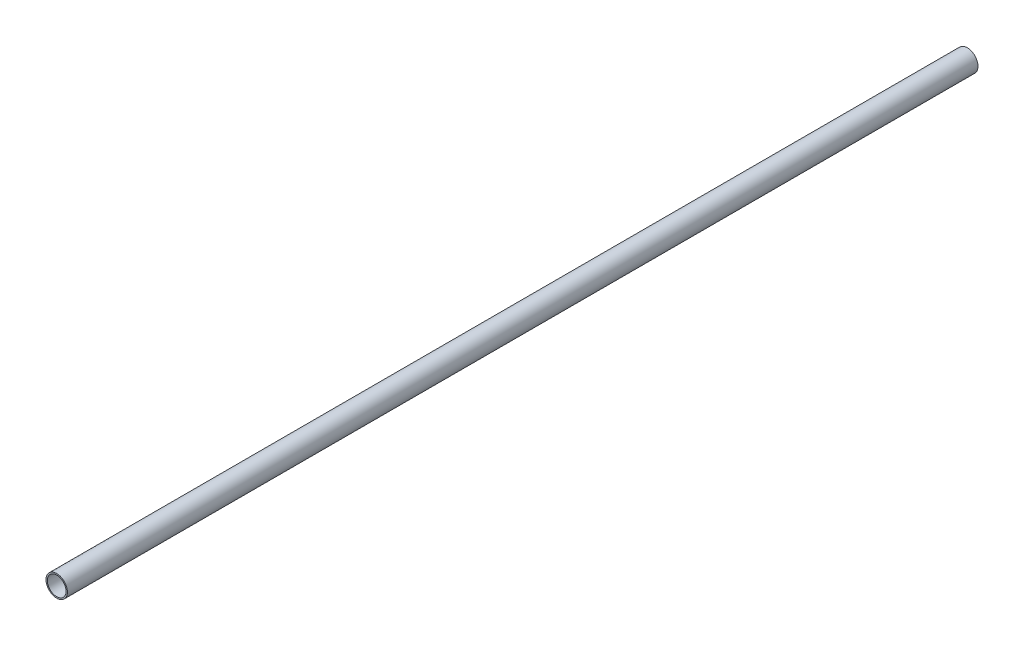
ISO-10303-21;
HEADER;
FILE_DESCRIPTION(('STEP AP214'),'2;1');
FILE_NAME('part.step','',(''),(''),'','','');
FILE_SCHEMA(('AUTOMOTIVE_DESIGN { 1 0 10303 214 1 1 1 1 }'));
ENDSEC;
DATA;
#1=APPLICATION_CONTEXT('core data for automotive mechanical design processes');
#2=APPLICATION_PROTOCOL_DEFINITION('international standard','automotive_design',2000,#1);
#3=PRODUCT_CONTEXT('',#1,'mechanical');
#4=PRODUCT('Part','Part','',(#3));
#5=PRODUCT_RELATED_PRODUCT_CATEGORY('part','',(#4));
#6=PRODUCT_DEFINITION_FORMATION('','',#4);
#7=PRODUCT_DEFINITION_CONTEXT('part definition',#1,'design');
#8=PRODUCT_DEFINITION('design','',#6,#7);
#9=PRODUCT_DEFINITION_SHAPE('','',#8);
#10=(LENGTH_UNIT() NAMED_UNIT(*) SI_UNIT(.MILLI.,.METRE.));
#11=(NAMED_UNIT(*) PLANE_ANGLE_UNIT() SI_UNIT($,.RADIAN.));
#12=(NAMED_UNIT(*) SI_UNIT($,.STERADIAN.) SOLID_ANGLE_UNIT());
#13=UNCERTAINTY_MEASURE_WITH_UNIT(LENGTH_MEASURE(1.E-05),#10,'distance_accuracy_value','');
#14=(GEOMETRIC_REPRESENTATION_CONTEXT(3) GLOBAL_UNCERTAINTY_ASSIGNED_CONTEXT((#13)) GLOBAL_UNIT_ASSIGNED_CONTEXT((#10,
#11,#12)) REPRESENTATION_CONTEXT('',''));
#15=CARTESIAN_POINT('',(0.,0.,0.));
#16=DIRECTION('',(0.,0.,1.));
#17=DIRECTION('',(1.,0.,0.));
#18=AXIS2_PLACEMENT_3D('',#15,#16,#17);
#19=CARTESIAN_POINT('',(0.,0.,340.));
#20=DIRECTION('',(0.,0.,1.));
#21=DIRECTION('',(1.,0.,0.));
#22=AXIS2_PLACEMENT_3D('',#19,#20,#21);
#23=PLANE('',#22);
#24=CARTESIAN_POINT('',(0.,0.,340.));
#25=DIRECTION('',(0.,0.,1.));
#26=DIRECTION('',(1.,0.,0.));
#27=AXIS2_PLACEMENT_3D('',#24,#25,#26);
#28=CIRCLE('',#27,8.);
#29=CARTESIAN_POINT('',(8.,0.,340.));
#30=VERTEX_POINT('',#29);
#31=EDGE_CURVE('E10',#30,#30,#28,.T.);
#32=ORIENTED_EDGE('',*,*,#31,.T.);
#33=EDGE_LOOP('',(#32));
#34=FACE_BOUND('',#33,.T.);
#35=CARTESIAN_POINT('',(0.,0.,340.));
#36=DIRECTION('',(0.,0.,1.));
#37=DIRECTION('',(1.,0.,0.));
#38=AXIS2_PLACEMENT_3D('',#35,#36,#37);
#39=CIRCLE('',#38,7.);
#40=CARTESIAN_POINT('',(7.,0.,340.));
#41=VERTEX_POINT('',#40);
#42=EDGE_CURVE('E44',#41,#41,#39,.T.);
#43=ORIENTED_EDGE('',*,*,#42,.F.);
#44=EDGE_LOOP('',(#43));
#45=FACE_BOUND('',#44,.T.);
#46=ADVANCED_FACE('F33',(#34,#45),#23,.T.);
#47=CARTESIAN_POINT('',(0.,0.,-340.));
#48=DIRECTION('',(0.,0.,1.));
#49=DIRECTION('',(1.,0.,0.));
#50=AXIS2_PLACEMENT_3D('',#47,#48,#49);
#51=PLANE('',#50);
#52=CARTESIAN_POINT('',(0.,0.,-340.));
#53=DIRECTION('',(0.,0.,1.));
#54=DIRECTION('',(1.,0.,0.));
#55=AXIS2_PLACEMENT_3D('',#52,#53,#54);
#56=CIRCLE('',#55,8.);
#57=CARTESIAN_POINT('',(8.,0.,-340.));
#58=VERTEX_POINT('',#57);
#59=EDGE_CURVE('E37',#58,#58,#56,.T.);
#60=ORIENTED_EDGE('',*,*,#59,.F.);
#61=EDGE_LOOP('',(#60));
#62=FACE_BOUND('',#61,.T.);
#63=CARTESIAN_POINT('',(0.,0.,-340.));
#64=DIRECTION('',(0.,0.,1.));
#65=DIRECTION('',(1.,0.,0.));
#66=AXIS2_PLACEMENT_3D('',#63,#64,#65);
#67=CIRCLE('',#66,7.);
#68=CARTESIAN_POINT('',(7.,0.,-340.));
#69=VERTEX_POINT('',#68);
#70=EDGE_CURVE('E46',#69,#69,#67,.T.);
#71=ORIENTED_EDGE('',*,*,#70,.T.);
#72=EDGE_LOOP('',(#71));
#73=FACE_BOUND('',#72,.T.);
#74=ADVANCED_FACE('F56',(#62,#73),#51,.F.);
#75=CARTESIAN_POINT('',(0.,0.,340.));
#76=DIRECTION('',(0.,0.,-1.));
#77=DIRECTION('',(-1.,0.,0.));
#78=AXIS2_PLACEMENT_3D('',#75,#76,#77);
#79=CYLINDRICAL_SURFACE('',#78,8.);
#80=ORIENTED_EDGE('',*,*,#31,.F.);
#81=EDGE_LOOP('',(#80));
#82=FACE_BOUND('',#81,.T.);
#83=ORIENTED_EDGE('',*,*,#59,.T.);
#84=EDGE_LOOP('',(#83));
#85=FACE_BOUND('',#84,.T.);
#86=ADVANCED_FACE('F35',(#82,#85),#79,.T.);
#87=CARTESIAN_POINT('',(0.,0.,340.));
#88=DIRECTION('',(0.,0.,-1.));
#89=DIRECTION('',(-1.,0.,0.));
#90=AXIS2_PLACEMENT_3D('',#87,#88,#89);
#91=CYLINDRICAL_SURFACE('',#90,7.);
#92=ORIENTED_EDGE('',*,*,#42,.T.);
#93=EDGE_LOOP('',(#92));
#94=FACE_BOUND('',#93,.T.);
#95=ORIENTED_EDGE('',*,*,#70,.F.);
#96=EDGE_LOOP('',(#95));
#97=FACE_BOUND('',#96,.T.);
#98=ADVANCED_FACE('F52',(#94,#97),#91,.F.);
#99=CLOSED_SHELL('',(#46,#74,#86,#98));
#100=MANIFOLD_SOLID_BREP('B2',#99);
#101=ADVANCED_BREP_SHAPE_REPRESENTATION('',(#18,#100),#14);
#102=SHAPE_DEFINITION_REPRESENTATION(#9,#101);
ENDSEC;
END-ISO-10303-21;
